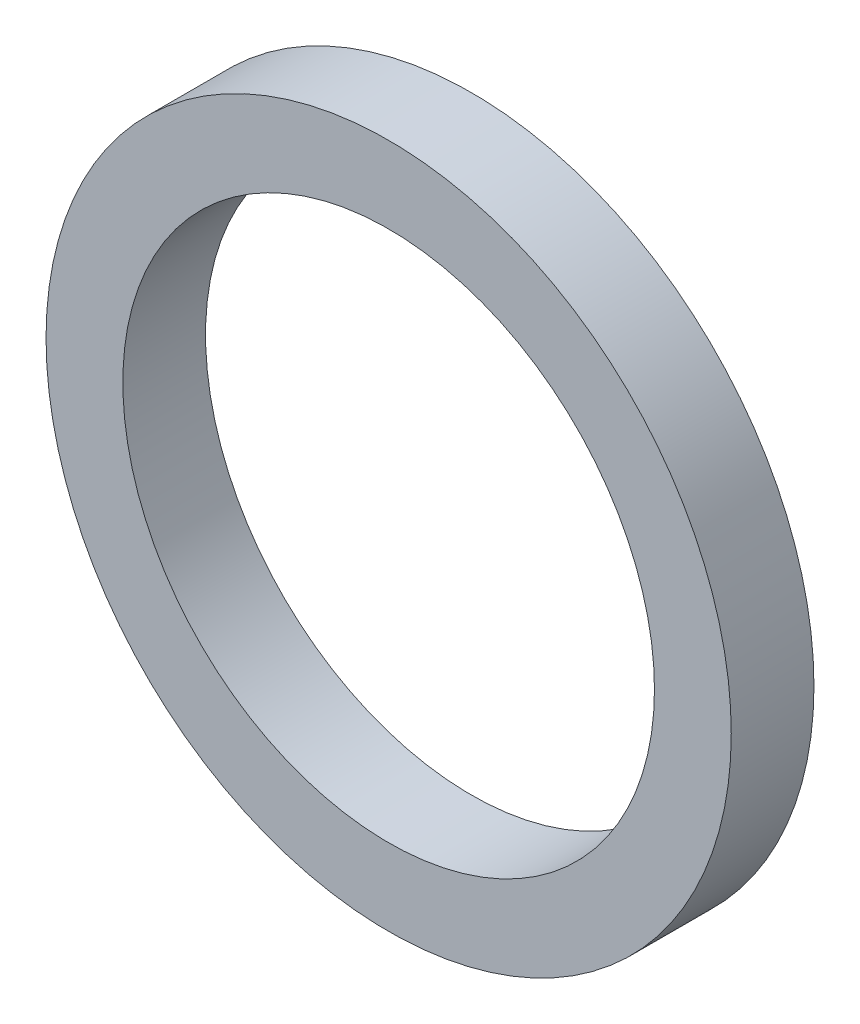
ISO-10303-21;
HEADER;
FILE_DESCRIPTION(('STEP AP214'),'2;1');
FILE_NAME('part.step','',(''),(''),'','','');
FILE_SCHEMA(('AUTOMOTIVE_DESIGN { 1 0 10303 214 1 1 1 1 }'));
ENDSEC;
DATA;
#1=APPLICATION_CONTEXT('core data for automotive mechanical design processes');
#2=APPLICATION_PROTOCOL_DEFINITION('international standard','automotive_design',2000,#1);
#3=PRODUCT_CONTEXT('',#1,'mechanical');
#4=PRODUCT('Part','Part','',(#3));
#5=PRODUCT_RELATED_PRODUCT_CATEGORY('part','',(#4));
#6=PRODUCT_DEFINITION_FORMATION('','',#4);
#7=PRODUCT_DEFINITION_CONTEXT('part definition',#1,'design');
#8=PRODUCT_DEFINITION('design','',#6,#7);
#9=PRODUCT_DEFINITION_SHAPE('','',#8);
#10=(LENGTH_UNIT() NAMED_UNIT(*) SI_UNIT(.MILLI.,.METRE.));
#11=(NAMED_UNIT(*) PLANE_ANGLE_UNIT() SI_UNIT($,.RADIAN.));
#12=(NAMED_UNIT(*) SI_UNIT($,.STERADIAN.) SOLID_ANGLE_UNIT());
#13=UNCERTAINTY_MEASURE_WITH_UNIT(LENGTH_MEASURE(1.E-05),#10,'distance_accuracy_value','');
#14=(GEOMETRIC_REPRESENTATION_CONTEXT(3) GLOBAL_UNCERTAINTY_ASSIGNED_CONTEXT((#13)) GLOBAL_UNIT_ASSIGNED_CONTEXT((#10,
#11,#12)) REPRESENTATION_CONTEXT('',''));
#15=CARTESIAN_POINT('',(0.,0.,0.));
#16=DIRECTION('',(0.,0.,1.));
#17=DIRECTION('',(1.,0.,0.));
#18=AXIS2_PLACEMENT_3D('',#15,#16,#17);
#19=CARTESIAN_POINT('',(0.,0.,7.));
#20=DIRECTION('',(0.,0.,1.));
#21=DIRECTION('',(1.,0.,0.));
#22=AXIS2_PLACEMENT_3D('',#19,#20,#21);
#23=PLANE('',#22);
#24=CARTESIAN_POINT('',(0.,0.,7.));
#25=DIRECTION('',(0.,0.,1.));
#26=DIRECTION('',(1.,0.,0.));
#27=AXIS2_PLACEMENT_3D('',#24,#25,#26);
#28=CIRCLE('',#27,29.);
#29=CARTESIAN_POINT('',(29.,0.,7.));
#30=VERTEX_POINT('',#29);
#31=EDGE_CURVE('E10',#30,#30,#28,.T.);
#32=ORIENTED_EDGE('',*,*,#31,.T.);
#33=EDGE_LOOP('',(#32));
#34=FACE_BOUND('',#33,.T.);
#35=CARTESIAN_POINT('',(0.,0.,7.));
#36=DIRECTION('',(0.,0.,1.));
#37=DIRECTION('',(1.,0.,0.));
#38=AXIS2_PLACEMENT_3D('',#35,#36,#37);
#39=CIRCLE('',#38,22.5);
#40=CARTESIAN_POINT('',(22.5,0.,7.));
#41=VERTEX_POINT('',#40);
#42=EDGE_CURVE('E50',#41,#41,#39,.T.);
#43=ORIENTED_EDGE('',*,*,#42,.F.);
#44=EDGE_LOOP('',(#43));
#45=FACE_BOUND('',#44,.T.);
#46=ADVANCED_FACE('F39',(#34,#45),#23,.T.);
#47=CARTESIAN_POINT('',(0.,0.,0.));
#48=DIRECTION('',(0.,0.,1.));
#49=DIRECTION('',(1.,0.,0.));
#50=AXIS2_PLACEMENT_3D('',#47,#48,#49);
#51=PLANE('',#50);
#52=CARTESIAN_POINT('',(0.,0.,0.));
#53=DIRECTION('',(0.,0.,1.));
#54=DIRECTION('',(1.,0.,0.));
#55=AXIS2_PLACEMENT_3D('',#52,#53,#54);
#56=CIRCLE('',#55,29.);
#57=CARTESIAN_POINT('',(29.,0.,0.));
#58=VERTEX_POINT('',#57);
#59=EDGE_CURVE('E43',#58,#58,#56,.T.);
#60=ORIENTED_EDGE('',*,*,#59,.F.);
#61=EDGE_LOOP('',(#60));
#62=FACE_BOUND('',#61,.T.);
#63=CARTESIAN_POINT('',(0.,0.,0.));
#64=DIRECTION('',(0.,0.,1.));
#65=DIRECTION('',(1.,0.,0.));
#66=AXIS2_PLACEMENT_3D('',#63,#64,#65);
#67=CIRCLE('',#66,22.5);
#68=CARTESIAN_POINT('',(22.5,0.,0.));
#69=VERTEX_POINT('',#68);
#70=EDGE_CURVE('E52',#69,#69,#67,.T.);
#71=ORIENTED_EDGE('',*,*,#70,.T.);
#72=EDGE_LOOP('',(#71));
#73=FACE_BOUND('',#72,.T.);
#74=ADVANCED_FACE('F62',(#62,#73),#51,.F.);
#75=CARTESIAN_POINT('',(0.,0.,7.));
#76=DIRECTION('',(0.,0.,-1.));
#77=DIRECTION('',(-1.,0.,0.));
#78=AXIS2_PLACEMENT_3D('',#75,#76,#77);
#79=CYLINDRICAL_SURFACE('',#78,29.);
#80=ORIENTED_EDGE('',*,*,#31,.F.);
#81=EDGE_LOOP('',(#80));
#82=FACE_BOUND('',#81,.T.);
#83=ORIENTED_EDGE('',*,*,#59,.T.);
#84=EDGE_LOOP('',(#83));
#85=FACE_BOUND('',#84,.T.);
#86=ADVANCED_FACE('F41',(#82,#85),#79,.T.);
#87=CARTESIAN_POINT('',(0.,0.,7.));
#88=DIRECTION('',(0.,0.,-1.));
#89=DIRECTION('',(-1.,0.,0.));
#90=AXIS2_PLACEMENT_3D('',#87,#88,#89);
#91=CYLINDRICAL_SURFACE('',#90,22.5);
#92=ORIENTED_EDGE('',*,*,#42,.T.);
#93=EDGE_LOOP('',(#92));
#94=FACE_BOUND('',#93,.T.);
#95=ORIENTED_EDGE('',*,*,#70,.F.);
#96=EDGE_LOOP('',(#95));
#97=FACE_BOUND('',#96,.T.);
#98=ADVANCED_FACE('F58',(#94,#97),#91,.F.);
#99=CLOSED_SHELL('',(#46,#74,#86,#98));
#100=MANIFOLD_SOLID_BREP('B2',#99);
#101=ADVANCED_BREP_SHAPE_REPRESENTATION('',(#18,#100),#14);
#102=SHAPE_DEFINITION_REPRESENTATION(#9,#101);
ENDSEC;
END-ISO-10303-21;
